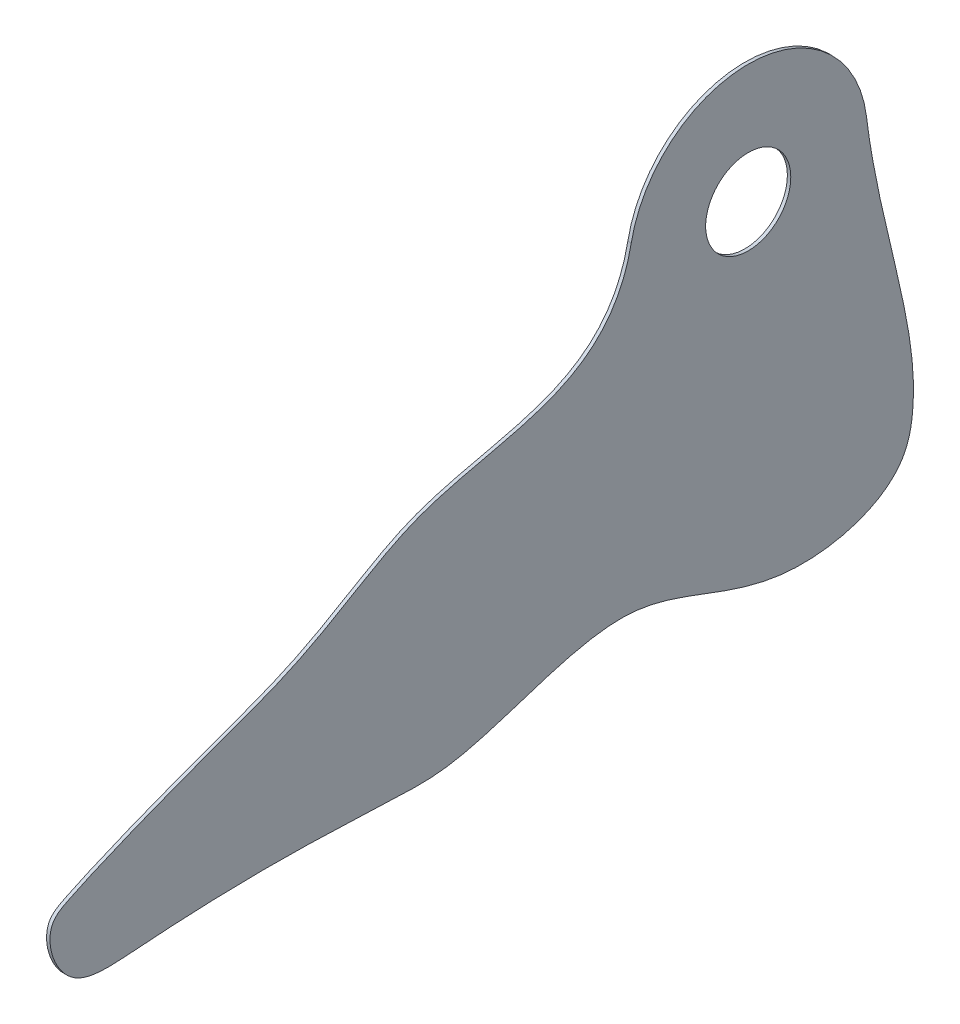
ISO-10303-21;
HEADER;
FILE_DESCRIPTION(('STEP AP214'),'2;1');
FILE_NAME('part.step','',(''),(''),'','','');
FILE_SCHEMA(('AUTOMOTIVE_DESIGN { 1 0 10303 214 1 1 1 1 }'));
ENDSEC;
DATA;
#1=APPLICATION_CONTEXT('core data for automotive mechanical design processes');
#2=APPLICATION_PROTOCOL_DEFINITION('international standard','automotive_design',2000,#1);
#3=PRODUCT_CONTEXT('',#1,'mechanical');
#4=PRODUCT('Part','Part','',(#3));
#5=PRODUCT_RELATED_PRODUCT_CATEGORY('part','',(#4));
#6=PRODUCT_DEFINITION_FORMATION('','',#4);
#7=PRODUCT_DEFINITION_CONTEXT('part definition',#1,'design');
#8=PRODUCT_DEFINITION('design','',#6,#7);
#9=PRODUCT_DEFINITION_SHAPE('','',#8);
#10=(LENGTH_UNIT() NAMED_UNIT(*) SI_UNIT(.MILLI.,.METRE.));
#11=(NAMED_UNIT(*) PLANE_ANGLE_UNIT() SI_UNIT($,.RADIAN.));
#12=(NAMED_UNIT(*) SI_UNIT($,.STERADIAN.) SOLID_ANGLE_UNIT());
#13=UNCERTAINTY_MEASURE_WITH_UNIT(LENGTH_MEASURE(1.E-05),#10,'distance_accuracy_value','');
#14=(GEOMETRIC_REPRESENTATION_CONTEXT(3) GLOBAL_UNCERTAINTY_ASSIGNED_CONTEXT((#13)) GLOBAL_UNIT_ASSIGNED_CONTEXT((#10,
#11,#12)) REPRESENTATION_CONTEXT('',''));
#15=CARTESIAN_POINT('',(0.,0.,0.));
#16=DIRECTION('',(0.,0.,1.));
#17=DIRECTION('',(1.,0.,0.));
#18=AXIS2_PLACEMENT_3D('',#15,#16,#17);
#19=CARTESIAN_POINT('',(0.5,1.22971626436364,135.172918469012));
#20=DIRECTION('',(1.,0.,0.));
#21=DIRECTION('',(0.,0.,-1.));
#22=AXIS2_PLACEMENT_3D('',#19,#20,#21);
#23=PLANE('',#22);
#24=CARTESIAN_POINT('',(0.5,106.697520621693,34.3532126230137));
#25=CARTESIAN_POINT('',(0.5,96.5120758490652,36.3389723583375));
#26=CARTESIAN_POINT('',(0.5,74.6210343356402,50.9488313962642));
#27=CARTESIAN_POINT('',(0.5,74.271899833285,85.726167748675));
#28=CARTESIAN_POINT('',(0.5,59.52862802141,114.840028166097));
#29=CARTESIAN_POINT('',(0.5,49.7183719795112,128.722122798005));
#30=CARTESIAN_POINT('',(0.5,36.5654091824399,165.298947788208));
#31=CARTESIAN_POINT('',(0.5,27.3203692235074,189.653696470663));
#32=CARTESIAN_POINT('',(0.5,18.0466592056465,207.902909488185));
#33=CARTESIAN_POINT('',(0.5,-2.04828371528678,201.423126117084));
#34=CARTESIAN_POINT('',(0.5,2.64154198871026,146.59385422396));
#35=CARTESIAN_POINT('',(0.5,0.641539370910988,120.144568987811));
#36=CARTESIAN_POINT('',(0.5,-0.701008571114696,77.9922289344648));
#37=CARTESIAN_POINT('',(0.5,23.7280040240564,34.7019521937525));
#38=CARTESIAN_POINT('',(0.5,-6.3572234243887,-4.09787511159141));
#39=CARTESIAN_POINT('',(0.5,4.46460283122143,-45.1754281349612));
#40=CARTESIAN_POINT('',(0.5,40.3815278342004,-52.1066083959957));
#41=CARTESIAN_POINT('',(0.5,72.343162645936,-38.6785632525415));
#42=CARTESIAN_POINT('',(0.5,104.283335150716,-34.7369117796422));
#43=B_SPLINE_CURVE_WITH_KNOTS('',3,(#24,#25,#26,#27,#28,#29,#30,#31,#32,#33,#34,#35,#36,#37,#38,
#39,#40,#41,#42),.UNSPECIFIED.,.F.,.F.,(4,1,1,1,1,1,1,1,1,1,1,1,1,1,1,1,4),(0.,
0.0545414456574115,0.168813510137349,0.190561729005899,0.262972311527685,0.282353100186241,
0.364988826932899,0.379148174971038,0.409787232529492,0.430597399392175,0.56643967673518,
0.595187435597811,0.701094703350607,0.796074321749431,0.860423876388229,0.880816444213286,1.),.UNSPECIFIED.);
#44=CARTESIAN_POINT('',(0.5,106.697520621693,34.3532126230137));
#45=VERTEX_POINT('',#44);
#46=CARTESIAN_POINT('',(0.5,104.283335150716,-34.7369117796422));
#47=VERTEX_POINT('',#46);
#48=EDGE_CURVE('E67',#45,#47,#43,.T.);
#49=ORIENTED_EDGE('',*,*,#48,.T.);
#50=CARTESIAN_POINT('',(0.5,100.,0.));
#51=DIRECTION('',(1.,0.,0.));
#52=DIRECTION('',(0.,0.,-1.));
#53=AXIS2_PLACEMENT_3D('',#50,#51,#52);
#54=CIRCLE('',#53,35.);
#55=EDGE_CURVE('E52',#47,#45,#54,.T.);
#56=ORIENTED_EDGE('',*,*,#55,.T.);
#57=EDGE_LOOP('',(#49,#56));
#58=FACE_BOUND('',#57,.T.);
#59=CARTESIAN_POINT('',(0.5,100.,0.));
#60=DIRECTION('',(1.,0.,0.));
#61=DIRECTION('',(0.,0.,-1.));
#62=AXIS2_PLACEMENT_3D('',#59,#60,#61);
#63=CIRCLE('',#62,12.5);
#64=CARTESIAN_POINT('',(0.5,100.,-12.5));
#65=VERTEX_POINT('',#64);
#66=EDGE_CURVE('E73',#65,#65,#63,.T.);
#67=ORIENTED_EDGE('',*,*,#66,.F.);
#68=EDGE_LOOP('',(#67));
#69=FACE_BOUND('',#68,.T.);
#70=ADVANCED_FACE('F35',(#58,#69),#23,.T.);
#71=CARTESIAN_POINT('',(-0.5,1.22971626436364,135.172918469012));
#72=DIRECTION('',(1.,0.,0.));
#73=DIRECTION('',(0.,0.,-1.));
#74=AXIS2_PLACEMENT_3D('',#71,#72,#73);
#75=PLANE('',#74);
#76=CARTESIAN_POINT('',(-0.5,106.697520621693,34.3532126230137));
#77=CARTESIAN_POINT('',(-0.5,96.5120758490652,36.3389723583375));
#78=CARTESIAN_POINT('',(-0.5,74.6210343356402,50.9488313962642));
#79=CARTESIAN_POINT('',(-0.5,74.271899833285,85.726167748675));
#80=CARTESIAN_POINT('',(-0.5,59.52862802141,114.840028166097));
#81=CARTESIAN_POINT('',(-0.5,49.7183719795112,128.722122798005));
#82=CARTESIAN_POINT('',(-0.5,36.5654091824399,165.298947788208));
#83=CARTESIAN_POINT('',(-0.5,27.3203692235074,189.653696470663));
#84=CARTESIAN_POINT('',(-0.5,18.0466592056465,207.902909488185));
#85=CARTESIAN_POINT('',(-0.5,-2.04828371528678,201.423126117084));
#86=CARTESIAN_POINT('',(-0.5,2.64154198871026,146.59385422396));
#87=CARTESIAN_POINT('',(-0.5,0.641539370910988,120.144568987811));
#88=CARTESIAN_POINT('',(-0.5,-0.701008571114696,77.9922289344648));
#89=CARTESIAN_POINT('',(-0.5,23.7280040240564,34.7019521937525));
#90=CARTESIAN_POINT('',(-0.5,-6.3572234243887,-4.09787511159141));
#91=CARTESIAN_POINT('',(-0.5,4.46460283122143,-45.1754281349612));
#92=CARTESIAN_POINT('',(-0.5,40.3815278342004,-52.1066083959957));
#93=CARTESIAN_POINT('',(-0.5,72.343162645936,-38.6785632525415));
#94=CARTESIAN_POINT('',(-0.5,104.283335150716,-34.7369117796422));
#95=B_SPLINE_CURVE_WITH_KNOTS('',3,(#76,#77,#78,#79,#80,#81,#82,#83,#84,#85,#86,#87,#88,#89,#90,
#91,#92,#93,#94),.UNSPECIFIED.,.F.,.F.,(4,1,1,1,1,1,1,1,1,1,1,1,1,1,1,1,4),(0.,
0.0545414456574115,0.168813510137349,0.190561729005899,0.262972311527685,0.282353100186241,
0.364988826932899,0.379148174971038,0.409787232529492,0.430597399392175,0.56643967673518,
0.595187435597811,0.701094703350607,0.796074321749431,0.860423876388229,0.880816444213286,1.),.UNSPECIFIED.);
#96=CARTESIAN_POINT('',(-0.5,106.697520621693,34.3532126230137));
#97=VERTEX_POINT('',#96);
#98=CARTESIAN_POINT('',(-0.5,104.283335150716,-34.7369117796422));
#99=VERTEX_POINT('',#98);
#100=EDGE_CURVE('E68',#97,#99,#95,.T.);
#101=ORIENTED_EDGE('',*,*,#100,.F.);
#102=CARTESIAN_POINT('',(-0.5,100.,0.));
#103=DIRECTION('',(1.,0.,0.));
#104=DIRECTION('',(0.,0.,-1.));
#105=AXIS2_PLACEMENT_3D('',#102,#103,#104);
#106=CIRCLE('',#105,35.);
#107=EDGE_CURVE('E60',#99,#97,#106,.T.);
#108=ORIENTED_EDGE('',*,*,#107,.F.);
#109=EDGE_LOOP('',(#101,#108));
#110=FACE_BOUND('',#109,.T.);
#111=CARTESIAN_POINT('',(-0.5,100.,0.));
#112=DIRECTION('',(1.,0.,0.));
#113=DIRECTION('',(0.,0.,-1.));
#114=AXIS2_PLACEMENT_3D('',#111,#112,#113);
#115=CIRCLE('',#114,12.5);
#116=CARTESIAN_POINT('',(-0.5,100.,-12.5));
#117=VERTEX_POINT('',#116);
#118=EDGE_CURVE('E76',#117,#117,#115,.T.);
#119=ORIENTED_EDGE('',*,*,#118,.T.);
#120=EDGE_LOOP('',(#119));
#121=FACE_BOUND('',#120,.T.);
#122=ADVANCED_FACE('F71',(#110,#121),#75,.F.);
#123=DIRECTION('',(-1.,0.,0.));
#124=VECTOR('',#123,1.);
#125=SURFACE_OF_LINEAR_EXTRUSION('',#43,#124);
#126=ORIENTED_EDGE('',*,*,#100,.T.);
#127=DIRECTION('',(-1.,0.,0.));
#128=VECTOR('',#127,1.);
#129=CARTESIAN_POINT('',(0.5,104.283335150716,-34.7369117796422));
#130=LINE('',#129,#128);
#131=EDGE_CURVE('E11',#47,#99,#130,.T.);
#132=ORIENTED_EDGE('',*,*,#131,.F.);
#133=ORIENTED_EDGE('',*,*,#48,.F.);
#134=DIRECTION('',(-1.,0.,0.));
#135=VECTOR('',#134,1.);
#136=CARTESIAN_POINT('',(0.5,106.697520621693,34.3532126230137));
#137=LINE('',#136,#135);
#138=EDGE_CURVE('E45',#45,#97,#137,.T.);
#139=ORIENTED_EDGE('',*,*,#138,.T.);
#140=EDGE_LOOP('',(#126,#132,#133,#139));
#141=FACE_BOUND('',#140,.T.);
#142=ADVANCED_FACE('F37',(#141),#125,.F.);
#143=CARTESIAN_POINT('',(0.5,100.,0.));
#144=DIRECTION('',(-1.,0.,0.));
#145=DIRECTION('',(0.,0.,1.));
#146=AXIS2_PLACEMENT_3D('',#143,#144,#145);
#147=CYLINDRICAL_SURFACE('',#146,35.);
#148=ORIENTED_EDGE('',*,*,#107,.T.);
#149=ORIENTED_EDGE('',*,*,#138,.F.);
#150=ORIENTED_EDGE('',*,*,#55,.F.);
#151=ORIENTED_EDGE('',*,*,#131,.T.);
#152=EDGE_LOOP('',(#148,#149,#150,#151));
#153=FACE_BOUND('',#152,.T.);
#154=ADVANCED_FACE('F63',(#153),#147,.T.);
#155=CARTESIAN_POINT('',(0.5,100.,0.));
#156=DIRECTION('',(-1.,0.,0.));
#157=DIRECTION('',(0.,0.,1.));
#158=AXIS2_PLACEMENT_3D('',#155,#156,#157);
#159=CYLINDRICAL_SURFACE('',#158,12.5);
#160=ORIENTED_EDGE('',*,*,#66,.T.);
#161=EDGE_LOOP('',(#160));
#162=FACE_BOUND('',#161,.T.);
#163=ORIENTED_EDGE('',*,*,#118,.F.);
#164=EDGE_LOOP('',(#163));
#165=FACE_BOUND('',#164,.T.);
#166=ADVANCED_FACE('F94',(#162,#165),#159,.F.);
#167=CLOSED_SHELL('',(#70,#122,#142,#154,#166));
#168=MANIFOLD_SOLID_BREP('B2',#167);
#169=ADVANCED_BREP_SHAPE_REPRESENTATION('',(#18,#168),#14);
#170=SHAPE_DEFINITION_REPRESENTATION(#9,#169);
ENDSEC;
END-ISO-10303-21;
